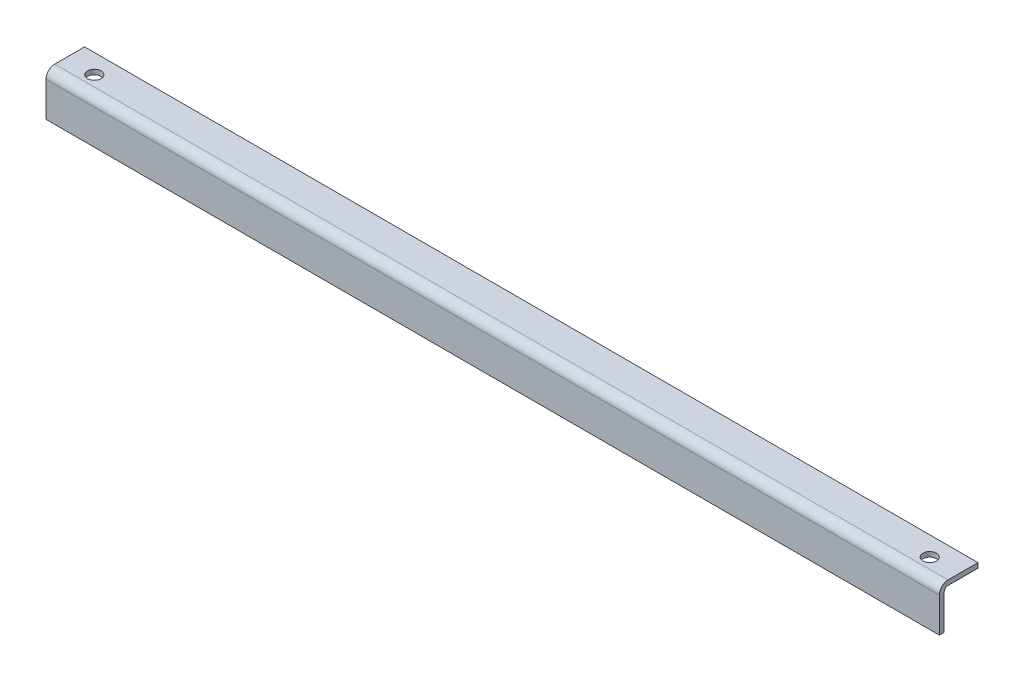
ISO-10303-21;
HEADER;
FILE_DESCRIPTION(('STEP AP214'),'2;1');
FILE_NAME('part.step','',(''),(''),'','','');
FILE_SCHEMA(('AUTOMOTIVE_DESIGN { 1 0 10303 214 1 1 1 1 }'));
ENDSEC;
DATA;
#1=APPLICATION_CONTEXT('core data for automotive mechanical design processes');
#2=APPLICATION_PROTOCOL_DEFINITION('international standard','automotive_design',2000,#1);
#3=PRODUCT_CONTEXT('',#1,'mechanical');
#4=PRODUCT('Part','Part','',(#3));
#5=PRODUCT_RELATED_PRODUCT_CATEGORY('part','',(#4));
#6=PRODUCT_DEFINITION_FORMATION('','',#4);
#7=PRODUCT_DEFINITION_CONTEXT('part definition',#1,'design');
#8=PRODUCT_DEFINITION('design','',#6,#7);
#9=PRODUCT_DEFINITION_SHAPE('','',#8);
#10=(LENGTH_UNIT() NAMED_UNIT(*) SI_UNIT(.MILLI.,.METRE.));
#11=(NAMED_UNIT(*) PLANE_ANGLE_UNIT() SI_UNIT($,.RADIAN.));
#12=(NAMED_UNIT(*) SI_UNIT($,.STERADIAN.) SOLID_ANGLE_UNIT());
#13=UNCERTAINTY_MEASURE_WITH_UNIT(LENGTH_MEASURE(1.E-05),#10,'distance_accuracy_value','');
#14=(GEOMETRIC_REPRESENTATION_CONTEXT(3) GLOBAL_UNCERTAINTY_ASSIGNED_CONTEXT((#13)) GLOBAL_UNIT_ASSIGNED_CONTEXT((#10,
#11,#12)) REPRESENTATION_CONTEXT('',''));
#15=CARTESIAN_POINT('',(0.,0.,0.));
#16=DIRECTION('',(0.,0.,1.));
#17=DIRECTION('',(1.,0.,0.));
#18=AXIS2_PLACEMENT_3D('',#15,#16,#17);
#19=CARTESIAN_POINT('',(231.253323675,2.5,10.));
#20=DIRECTION('',(-1.,0.,0.));
#21=DIRECTION('',(0.,0.,1.));
#22=AXIS2_PLACEMENT_3D('',#19,#20,#21);
#23=PLANE('',#22);
#24=DIRECTION('',(0.,0.,-1.));
#25=VECTOR('',#24,1.);
#26=CARTESIAN_POINT('',(231.253323675,2.5,10.));
#27=LINE('',#26,#25);
#28=CARTESIAN_POINT('',(231.253323675,2.5,5.5));
#29=VERTEX_POINT('',#28);
#30=CARTESIAN_POINT('',(231.253323675,2.5,-10.));
#31=VERTEX_POINT('',#30);
#32=EDGE_CURVE('E153',#29,#31,#27,.T.);
#33=ORIENTED_EDGE('',*,*,#32,.F.);
#34=CARTESIAN_POINT('',(231.253323675,-2.,5.5));
#35=DIRECTION('',(-1.,0.,0.));
#36=DIRECTION('',(0.,0.,1.));
#37=AXIS2_PLACEMENT_3D('',#34,#35,#36);
#38=CIRCLE('',#37,4.5);
#39=CARTESIAN_POINT('',(231.253323675,-2.,10.));
#40=VERTEX_POINT('',#39);
#41=EDGE_CURVE('E61',#29,#40,#38,.F.);
#42=ORIENTED_EDGE('',*,*,#41,.T.);
#43=DIRECTION('',(0.,-1.,0.));
#44=VECTOR('',#43,1.);
#45=CARTESIAN_POINT('',(231.253323675,2.5,10.));
#46=LINE('',#45,#44);
#47=CARTESIAN_POINT('',(231.253323675,-20.,10.));
#48=VERTEX_POINT('',#47);
#49=EDGE_CURVE('E100',#40,#48,#46,.T.);
#50=ORIENTED_EDGE('',*,*,#49,.T.);
#51=DIRECTION('',(0.,0.,1.));
#52=VECTOR('',#51,1.);
#53=CARTESIAN_POINT('',(231.253323675,-20.,10.));
#54=LINE('',#53,#52);
#55=CARTESIAN_POINT('',(231.253323675,-20.,7.5));
#56=VERTEX_POINT('',#55);
#57=EDGE_CURVE('E104',#56,#48,#54,.T.);
#58=ORIENTED_EDGE('',*,*,#57,.F.);
#59=DIRECTION('',(0.,1.,0.));
#60=VECTOR('',#59,1.);
#61=CARTESIAN_POINT('',(231.253323675,-20.,7.5));
#62=LINE('',#61,#60);
#63=CARTESIAN_POINT('',(231.253323675,-2.,7.5));
#64=VERTEX_POINT('',#63);
#65=EDGE_CURVE('E129',#56,#64,#62,.T.);
#66=ORIENTED_EDGE('',*,*,#65,.T.);
#67=CARTESIAN_POINT('',(231.253323675,-2.,5.5));
#68=DIRECTION('',(-1.,0.,0.));
#69=DIRECTION('',(0.,0.,1.));
#70=AXIS2_PLACEMENT_3D('',#67,#68,#69);
#71=CIRCLE('',#70,2.);
#72=CARTESIAN_POINT('',(231.253323675,0.,5.5));
#73=VERTEX_POINT('',#72);
#74=EDGE_CURVE('E188',#64,#73,#71,.T.);
#75=ORIENTED_EDGE('',*,*,#74,.T.);
#76=DIRECTION('',(0.,0.,-1.));
#77=VECTOR('',#76,1.);
#78=CARTESIAN_POINT('',(231.253323675,0.,10.));
#79=LINE('',#78,#77);
#80=CARTESIAN_POINT('',(231.253323675,0.,-10.));
#81=VERTEX_POINT('',#80);
#82=EDGE_CURVE('E141',#73,#81,#79,.T.);
#83=ORIENTED_EDGE('',*,*,#82,.T.);
#84=DIRECTION('',(0.,-1.,0.));
#85=VECTOR('',#84,1.);
#86=CARTESIAN_POINT('',(231.253323675,2.5,-10.));
#87=LINE('',#86,#85);
#88=EDGE_CURVE('E177',#31,#81,#87,.T.);
#89=ORIENTED_EDGE('',*,*,#88,.F.);
#90=EDGE_LOOP('',(#33,#42,#50,#58,#66,#75,#83,#89));
#91=FACE_BOUND('',#90,.T.);
#92=ADVANCED_FACE('F38',(#91),#23,.F.);
#93=CARTESIAN_POINT('',(-231.253323675,2.5,-10.));
#94=DIRECTION('',(0.,0.,1.));
#95=DIRECTION('',(1.,0.,0.));
#96=AXIS2_PLACEMENT_3D('',#93,#94,#95);
#97=PLANE('',#96);
#98=DIRECTION('',(-1.,0.,0.));
#99=VECTOR('',#98,1.);
#100=CARTESIAN_POINT('',(-231.253323675,0.,-10.));
#101=LINE('',#100,#99);
#102=CARTESIAN_POINT('',(-231.253323675,0.,-10.));
#103=VERTEX_POINT('',#102);
#104=EDGE_CURVE('E165',#81,#103,#101,.T.);
#105=ORIENTED_EDGE('',*,*,#104,.T.);
#106=DIRECTION('',(0.,-1.,0.));
#107=VECTOR('',#106,1.);
#108=CARTESIAN_POINT('',(-231.253323675,2.5,-10.));
#109=LINE('',#108,#107);
#110=CARTESIAN_POINT('',(-231.253323675,2.5,-10.));
#111=VERTEX_POINT('',#110);
#112=EDGE_CURVE('E173',#111,#103,#109,.T.);
#113=ORIENTED_EDGE('',*,*,#112,.F.);
#114=DIRECTION('',(-1.,0.,0.));
#115=VECTOR('',#114,1.);
#116=CARTESIAN_POINT('',(-231.253323675,2.5,-10.));
#117=LINE('',#116,#115);
#118=EDGE_CURVE('E156',#31,#111,#117,.T.);
#119=ORIENTED_EDGE('',*,*,#118,.F.);
#120=ORIENTED_EDGE('',*,*,#88,.T.);
#121=EDGE_LOOP('',(#105,#113,#119,#120));
#122=FACE_BOUND('',#121,.T.);
#123=ADVANCED_FACE('F238',(#122),#97,.F.);
#124=CARTESIAN_POINT('',(-231.253323675,2.5,10.));
#125=DIRECTION('',(1.,0.,0.));
#126=DIRECTION('',(0.,0.,-1.));
#127=AXIS2_PLACEMENT_3D('',#124,#125,#126);
#128=PLANE('',#127);
#129=DIRECTION('',(0.,-1.,0.));
#130=VECTOR('',#129,1.);
#131=CARTESIAN_POINT('',(-231.253323675,2.5,10.));
#132=LINE('',#131,#130);
#133=CARTESIAN_POINT('',(-231.253323675,-2.,10.));
#134=VERTEX_POINT('',#133);
#135=CARTESIAN_POINT('',(-231.253323675,-20.,9.99999999999994));
#136=VERTEX_POINT('',#135);
#137=EDGE_CURVE('E106',#134,#136,#132,.T.);
#138=ORIENTED_EDGE('',*,*,#137,.F.);
#139=CARTESIAN_POINT('',(-231.253323675,-2.,5.5));
#140=DIRECTION('',(1.,0.,0.));
#141=DIRECTION('',(0.,0.,-1.));
#142=AXIS2_PLACEMENT_3D('',#139,#140,#141);
#143=CIRCLE('',#142,4.5);
#144=CARTESIAN_POINT('',(-231.253323675,2.5,5.5));
#145=VERTEX_POINT('',#144);
#146=EDGE_CURVE('E11',#134,#145,#143,.F.);
#147=ORIENTED_EDGE('',*,*,#146,.T.);
#148=DIRECTION('',(0.,0.,1.));
#149=VECTOR('',#148,1.);
#150=CARTESIAN_POINT('',(-231.253323675,2.5,10.));
#151=LINE('',#150,#149);
#152=EDGE_CURVE('E107',#111,#145,#151,.T.);
#153=ORIENTED_EDGE('',*,*,#152,.F.);
#154=ORIENTED_EDGE('',*,*,#112,.T.);
#155=DIRECTION('',(0.,0.,1.));
#156=VECTOR('',#155,1.);
#157=CARTESIAN_POINT('',(-231.253323675,0.,10.));
#158=LINE('',#157,#156);
#159=CARTESIAN_POINT('',(-231.253323675,0.,5.49999999999994));
#160=VERTEX_POINT('',#159);
#161=EDGE_CURVE('E157',#103,#160,#158,.T.);
#162=ORIENTED_EDGE('',*,*,#161,.T.);
#163=CARTESIAN_POINT('',(-231.253323675,-2.,5.49999999999994));
#164=DIRECTION('',(1.,0.,0.));
#165=DIRECTION('',(0.,0.,-1.));
#166=AXIS2_PLACEMENT_3D('',#163,#164,#165);
#167=CIRCLE('',#166,2.);
#168=CARTESIAN_POINT('',(-231.253323675,-2.,7.49999999999994));
#169=VERTEX_POINT('',#168);
#170=EDGE_CURVE('E191',#160,#169,#167,.T.);
#171=ORIENTED_EDGE('',*,*,#170,.T.);
#172=DIRECTION('',(0.,1.,0.));
#173=VECTOR('',#172,1.);
#174=CARTESIAN_POINT('',(-231.253323675,-20.,7.49999999999994));
#175=LINE('',#174,#173);
#176=CARTESIAN_POINT('',(-231.253323675,-20.,7.49999999999994));
#177=VERTEX_POINT('',#176);
#178=EDGE_CURVE('E132',#177,#169,#175,.T.);
#179=ORIENTED_EDGE('',*,*,#178,.F.);
#180=DIRECTION('',(0.,0.,-1.));
#181=VECTOR('',#180,1.);
#182=CARTESIAN_POINT('',(-231.253323675,-20.,9.99999999999994));
#183=LINE('',#182,#181);
#184=EDGE_CURVE('E115',#136,#177,#183,.T.);
#185=ORIENTED_EDGE('',*,*,#184,.F.);
#186=EDGE_LOOP('',(#138,#147,#153,#154,#162,#171,#179,#185));
#187=FACE_BOUND('',#186,.T.);
#188=ADVANCED_FACE('F242',(#187),#128,.F.);
#189=CARTESIAN_POINT('',(-231.253323675,2.5,10.));
#190=DIRECTION('',(0.,0.,-1.));
#191=DIRECTION('',(-1.,0.,0.));
#192=AXIS2_PLACEMENT_3D('',#189,#190,#191);
#193=PLANE('',#192);
#194=ORIENTED_EDGE('',*,*,#49,.F.);
#195=DIRECTION('',(1.,0.,0.));
#196=VECTOR('',#195,1.);
#197=CARTESIAN_POINT('',(-231.253323675,-2.,10.));
#198=LINE('',#197,#196);
#199=EDGE_CURVE('E47',#40,#134,#198,.F.);
#200=ORIENTED_EDGE('',*,*,#199,.T.);
#201=ORIENTED_EDGE('',*,*,#137,.T.);
#202=DIRECTION('',(-1.,0.,0.));
#203=VECTOR('',#202,1.);
#204=CARTESIAN_POINT('',(231.253323675,-20.,10.));
#205=LINE('',#204,#203);
#206=EDGE_CURVE('E110',#48,#136,#205,.T.);
#207=ORIENTED_EDGE('',*,*,#206,.F.);
#208=EDGE_LOOP('',(#194,#200,#201,#207));
#209=FACE_BOUND('',#208,.T.);
#210=ADVANCED_FACE('F111',(#209),#193,.F.);
#211=CARTESIAN_POINT('',(0.,2.5,0.));
#212=DIRECTION('',(0.,-1.,0.));
#213=DIRECTION('',(0.,0.,-1.));
#214=AXIS2_PLACEMENT_3D('',#211,#212,#213);
#215=PLANE('',#214);
#216=CARTESIAN_POINT('',(216.253323675,2.5,0.));
#217=DIRECTION('',(0.,1.,0.));
#218=DIRECTION('',(0.,0.,1.));
#219=AXIS2_PLACEMENT_3D('',#216,#217,#218);
#220=CIRCLE('',#219,3.50000000000002);
#221=CARTESIAN_POINT('',(216.253323675,2.5,3.50000000000002));
#222=VERTEX_POINT('',#221);
#223=EDGE_CURVE('E142',#222,#222,#220,.T.);
#224=ORIENTED_EDGE('',*,*,#223,.F.);
#225=EDGE_LOOP('',(#224));
#226=FACE_BOUND('',#225,.T.);
#227=CARTESIAN_POINT('',(-216.253323675,2.5,0.));
#228=DIRECTION('',(0.,1.,0.));
#229=DIRECTION('',(0.,0.,1.));
#230=AXIS2_PLACEMENT_3D('',#227,#228,#229);
#231=CIRCLE('',#230,3.50000000000002);
#232=CARTESIAN_POINT('',(-216.253323675,2.5,3.50000000000002));
#233=VERTEX_POINT('',#232);
#234=EDGE_CURVE('E136',#233,#233,#231,.T.);
#235=ORIENTED_EDGE('',*,*,#234,.F.);
#236=EDGE_LOOP('',(#235));
#237=FACE_BOUND('',#236,.T.);
#238=ORIENTED_EDGE('',*,*,#152,.T.);
#239=DIRECTION('',(1.,0.,0.));
#240=VECTOR('',#239,1.);
#241=CARTESIAN_POINT('',(0.,2.5,5.5));
#242=LINE('',#241,#240);
#243=EDGE_CURVE('E194',#145,#29,#242,.T.);
#244=ORIENTED_EDGE('',*,*,#243,.T.);
#245=ORIENTED_EDGE('',*,*,#32,.T.);
#246=ORIENTED_EDGE('',*,*,#118,.T.);
#247=EDGE_LOOP('',(#238,#244,#245,#246));
#248=FACE_BOUND('',#247,.T.);
#249=ADVANCED_FACE('F229',(#226,#237,#248),#215,.F.);
#250=CARTESIAN_POINT('',(0.,0.,0.));
#251=DIRECTION('',(0.,-1.,0.));
#252=DIRECTION('',(0.,0.,-1.));
#253=AXIS2_PLACEMENT_3D('',#250,#251,#252);
#254=PLANE('',#253);
#255=ORIENTED_EDGE('',*,*,#82,.F.);
#256=DIRECTION('',(1.,0.,0.));
#257=VECTOR('',#256,1.);
#258=CARTESIAN_POINT('',(0.,0.,5.49999999999997));
#259=LINE('',#258,#257);
#260=EDGE_CURVE('E185',#73,#160,#259,.F.);
#261=ORIENTED_EDGE('',*,*,#260,.T.);
#262=ORIENTED_EDGE('',*,*,#161,.F.);
#263=ORIENTED_EDGE('',*,*,#104,.F.);
#264=EDGE_LOOP('',(#255,#261,#262,#263));
#265=FACE_BOUND('',#264,.T.);
#266=CARTESIAN_POINT('',(216.253323675,0.,0.));
#267=DIRECTION('',(0.,1.,0.));
#268=DIRECTION('',(0.,0.,1.));
#269=AXIS2_PLACEMENT_3D('',#266,#267,#268);
#270=CIRCLE('',#269,3.50000000000002);
#271=CARTESIAN_POINT('',(216.253323675,0.,3.50000000000002));
#272=VERTEX_POINT('',#271);
#273=EDGE_CURVE('E137',#272,#272,#270,.T.);
#274=ORIENTED_EDGE('',*,*,#273,.T.);
#275=EDGE_LOOP('',(#274));
#276=FACE_BOUND('',#275,.T.);
#277=CARTESIAN_POINT('',(-216.253323675,0.,0.));
#278=DIRECTION('',(0.,1.,0.));
#279=DIRECTION('',(0.,0.,1.));
#280=AXIS2_PLACEMENT_3D('',#277,#278,#279);
#281=CIRCLE('',#280,3.50000000000002);
#282=CARTESIAN_POINT('',(-216.253323675,0.,3.50000000000002));
#283=VERTEX_POINT('',#282);
#284=EDGE_CURVE('E146',#283,#283,#281,.T.);
#285=ORIENTED_EDGE('',*,*,#284,.T.);
#286=EDGE_LOOP('',(#285));
#287=FACE_BOUND('',#286,.T.);
#288=ADVANCED_FACE('F260',(#265,#276,#287),#254,.T.);
#289=CARTESIAN_POINT('',(-216.253323675,0.,0.));
#290=DIRECTION('',(0.,1.,0.));
#291=DIRECTION('',(0.,0.,1.));
#292=AXIS2_PLACEMENT_3D('',#289,#290,#291);
#293=CYLINDRICAL_SURFACE('',#292,3.50000000000002);
#294=ORIENTED_EDGE('',*,*,#284,.F.);
#295=EDGE_LOOP('',(#294));
#296=FACE_BOUND('',#295,.T.);
#297=ORIENTED_EDGE('',*,*,#234,.T.);
#298=EDGE_LOOP('',(#297));
#299=FACE_BOUND('',#298,.T.);
#300=ADVANCED_FACE('F263',(#296,#299),#293,.F.);
#301=CARTESIAN_POINT('',(216.253323675,0.,0.));
#302=DIRECTION('',(0.,1.,0.));
#303=DIRECTION('',(0.,0.,1.));
#304=AXIS2_PLACEMENT_3D('',#301,#302,#303);
#305=CYLINDRICAL_SURFACE('',#304,3.50000000000002);
#306=ORIENTED_EDGE('',*,*,#273,.F.);
#307=EDGE_LOOP('',(#306));
#308=FACE_BOUND('',#307,.T.);
#309=ORIENTED_EDGE('',*,*,#223,.T.);
#310=EDGE_LOOP('',(#309));
#311=FACE_BOUND('',#310,.T.);
#312=ADVANCED_FACE('F270',(#308,#311),#305,.F.);
#313=CARTESIAN_POINT('',(231.253323675,-20.,7.5));
#314=DIRECTION('',(0.,0.,1.));
#315=DIRECTION('',(1.,0.,0.));
#316=AXIS2_PLACEMENT_3D('',#313,#314,#315);
#317=PLANE('',#316);
#318=ORIENTED_EDGE('',*,*,#178,.T.);
#319=DIRECTION('',(1.,0.,0.));
#320=VECTOR('',#319,1.);
#321=CARTESIAN_POINT('',(231.253323675,-2.,7.5));
#322=LINE('',#321,#320);
#323=EDGE_CURVE('E181',#169,#64,#322,.T.);
#324=ORIENTED_EDGE('',*,*,#323,.T.);
#325=ORIENTED_EDGE('',*,*,#65,.F.);
#326=DIRECTION('',(1.,0.,0.));
#327=VECTOR('',#326,1.);
#328=CARTESIAN_POINT('',(231.253323675,-20.,7.5));
#329=LINE('',#328,#327);
#330=EDGE_CURVE('E119',#177,#56,#329,.T.);
#331=ORIENTED_EDGE('',*,*,#330,.F.);
#332=EDGE_LOOP('',(#318,#324,#325,#331));
#333=FACE_BOUND('',#332,.T.);
#334=ADVANCED_FACE('F274',(#333),#317,.F.);
#335=CARTESIAN_POINT('',(0.,-20.,0.));
#336=DIRECTION('',(0.,1.,0.));
#337=DIRECTION('',(0.,0.,1.));
#338=AXIS2_PLACEMENT_3D('',#335,#336,#337);
#339=PLANE('',#338);
#340=ORIENTED_EDGE('',*,*,#57,.T.);
#341=ORIENTED_EDGE('',*,*,#206,.T.);
#342=ORIENTED_EDGE('',*,*,#184,.T.);
#343=ORIENTED_EDGE('',*,*,#330,.T.);
#344=EDGE_LOOP('',(#340,#341,#342,#343));
#345=FACE_BOUND('',#344,.T.);
#346=ADVANCED_FACE('F117',(#345),#339,.F.);
#347=CARTESIAN_POINT('',(231.253323675,-2.,5.5));
#348=DIRECTION('',(1.,0.,0.));
#349=DIRECTION('',(0.,0.,-1.));
#350=AXIS2_PLACEMENT_3D('',#347,#348,#349);
#351=CYLINDRICAL_SURFACE('',#350,2.);
#352=ORIENTED_EDGE('',*,*,#170,.F.);
#353=ORIENTED_EDGE('',*,*,#260,.F.);
#354=ORIENTED_EDGE('',*,*,#74,.F.);
#355=ORIENTED_EDGE('',*,*,#323,.F.);
#356=EDGE_LOOP('',(#352,#353,#354,#355));
#357=FACE_BOUND('',#356,.T.);
#358=ADVANCED_FACE('F244',(#357),#351,.F.);
#359=CARTESIAN_POINT('',(0.,-2.,5.5));
#360=DIRECTION('',(1.,0.,0.));
#361=DIRECTION('',(0.,0.,-1.));
#362=AXIS2_PLACEMENT_3D('',#359,#360,#361);
#363=CYLINDRICAL_SURFACE('',#362,4.5);
#364=ORIENTED_EDGE('',*,*,#146,.F.);
#365=ORIENTED_EDGE('',*,*,#199,.F.);
#366=ORIENTED_EDGE('',*,*,#41,.F.);
#367=ORIENTED_EDGE('',*,*,#243,.F.);
#368=EDGE_LOOP('',(#364,#365,#366,#367));
#369=FACE_BOUND('',#368,.T.);
#370=ADVANCED_FACE('F40',(#369),#363,.T.);
#371=CLOSED_SHELL('',(#92,#123,#188,#210,#249,#288,#300,#312,#334,#346,#358,#370));
#372=MANIFOLD_SOLID_BREP('B2',#371);
#373=ADVANCED_BREP_SHAPE_REPRESENTATION('',(#18,#372),#14);
#374=SHAPE_DEFINITION_REPRESENTATION(#9,#373);
ENDSEC;
END-ISO-10303-21;
